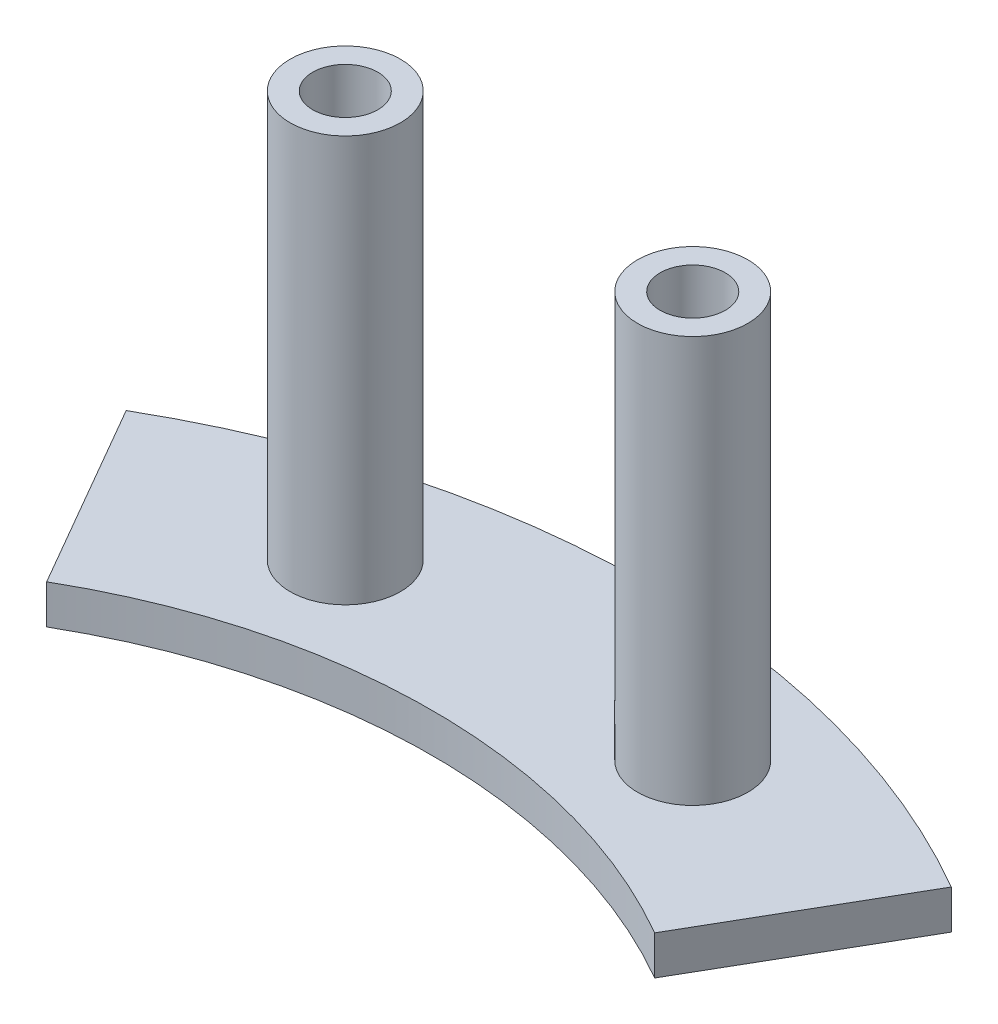
ISO-10303-21;
HEADER;
FILE_DESCRIPTION(('STEP AP214'),'2;1');
FILE_NAME('part.step','',(''),(''),'','','');
FILE_SCHEMA(('AUTOMOTIVE_DESIGN { 1 0 10303 214 1 1 1 1 }'));
ENDSEC;
DATA;
#1=APPLICATION_CONTEXT('core data for automotive mechanical design processes');
#2=APPLICATION_PROTOCOL_DEFINITION('international standard','automotive_design',2000,#1);
#3=PRODUCT_CONTEXT('',#1,'mechanical');
#4=PRODUCT('Part','Part','',(#3));
#5=PRODUCT_RELATED_PRODUCT_CATEGORY('part','',(#4));
#6=PRODUCT_DEFINITION_FORMATION('','',#4);
#7=PRODUCT_DEFINITION_CONTEXT('part definition',#1,'design');
#8=PRODUCT_DEFINITION('design','',#6,#7);
#9=PRODUCT_DEFINITION_SHAPE('','',#8);
#10=(LENGTH_UNIT() NAMED_UNIT(*) SI_UNIT(.MILLI.,.METRE.));
#11=(NAMED_UNIT(*) PLANE_ANGLE_UNIT() SI_UNIT($,.RADIAN.));
#12=(NAMED_UNIT(*) SI_UNIT($,.STERADIAN.) SOLID_ANGLE_UNIT());
#13=UNCERTAINTY_MEASURE_WITH_UNIT(LENGTH_MEASURE(1.E-05),#10,'distance_accuracy_value','');
#14=(GEOMETRIC_REPRESENTATION_CONTEXT(3) GLOBAL_UNCERTAINTY_ASSIGNED_CONTEXT((#13)) GLOBAL_UNIT_ASSIGNED_CONTEXT((#10,
#11,#12)) REPRESENTATION_CONTEXT('',''));
#15=CARTESIAN_POINT('',(0.,0.,0.));
#16=DIRECTION('',(0.,0.,1.));
#17=DIRECTION('',(1.,0.,0.));
#18=AXIS2_PLACEMENT_3D('',#15,#16,#17);
#19=CARTESIAN_POINT('',(0.,1.8,0.));
#20=DIRECTION('',(0.,-1.,0.));
#21=DIRECTION('',(0.,0.,-1.));
#22=AXIS2_PLACEMENT_3D('',#19,#20,#21);
#23=CYLINDRICAL_SURFACE('',#22,38.);
#24=CARTESIAN_POINT('',(0.,0.,0.));
#25=DIRECTION('',(0.,1.,0.));
#26=DIRECTION('',(0.,0.,-1.));
#27=AXIS2_PLACEMENT_3D('',#24,#25,#26);
#28=CIRCLE('',#27,38.);
#29=CARTESIAN_POINT('',(18.9999999999999,0.,-32.9089653438087));
#30=VERTEX_POINT('',#29);
#31=CARTESIAN_POINT('',(-19.0000000000001,0.,-32.9089653438086));
#32=VERTEX_POINT('',#31);
#33=EDGE_CURVE('E108',#30,#32,#28,.T.);
#34=ORIENTED_EDGE('',*,*,#33,.T.);
#35=DIRECTION('',(0.,-1.,0.));
#36=VECTOR('',#35,1.);
#37=CARTESIAN_POINT('',(-19.0000000000001,1.8,-32.9089653438086));
#38=LINE('',#37,#36);
#39=CARTESIAN_POINT('',(-19.0000000000001,1.8,-32.9089653438086));
#40=VERTEX_POINT('',#39);
#41=EDGE_CURVE('E100',#40,#32,#38,.T.);
#42=ORIENTED_EDGE('',*,*,#41,.F.);
#43=CARTESIAN_POINT('',(0.,1.8,0.));
#44=DIRECTION('',(0.,1.,0.));
#45=DIRECTION('',(0.,0.,-1.));
#46=AXIS2_PLACEMENT_3D('',#43,#44,#45);
#47=CIRCLE('',#46,38.);
#48=CARTESIAN_POINT('',(18.9999999999999,1.8,-32.9089653438087));
#49=VERTEX_POINT('',#48);
#50=EDGE_CURVE('E92',#49,#40,#47,.T.);
#51=ORIENTED_EDGE('',*,*,#50,.F.);
#52=DIRECTION('',(0.,-1.,0.));
#53=VECTOR('',#52,1.);
#54=CARTESIAN_POINT('',(18.9999999999999,1.8,-32.9089653438087));
#55=LINE('',#54,#53);
#56=EDGE_CURVE('E104',#49,#30,#55,.T.);
#57=ORIENTED_EDGE('',*,*,#56,.T.);
#58=EDGE_LOOP('',(#34,#42,#51,#57));
#59=FACE_BOUND('',#58,.T.);
#60=ADVANCED_FACE('F41',(#59),#23,.T.);
#61=CARTESIAN_POINT('',(-19.0000000000001,1.8,-32.9089653438086));
#62=DIRECTION('',(0.866025403784436,0.,-0.500000000000004));
#63=DIRECTION('',(-0.500000000000004,0.,-0.866025403784437));
#64=AXIS2_PLACEMENT_3D('',#61,#62,#63);
#65=PLANE('',#64);
#66=DIRECTION('',(0.500000000000004,0.,0.866025403784436));
#67=VECTOR('',#66,1.);
#68=CARTESIAN_POINT('',(-19.0000000000001,0.,-32.9089653438086));
#69=LINE('',#68,#67);
#70=CARTESIAN_POINT('',(-14.0000000000001,0.,-24.2487113059642));
#71=VERTEX_POINT('',#70);
#72=EDGE_CURVE('E96',#32,#71,#69,.T.);
#73=ORIENTED_EDGE('',*,*,#72,.T.);
#74=DIRECTION('',(0.,-1.,0.));
#75=VECTOR('',#74,1.);
#76=CARTESIAN_POINT('',(-14.0000000000001,1.8,-24.2487113059642));
#77=LINE('',#76,#75);
#78=CARTESIAN_POINT('',(-14.0000000000001,1.8,-24.2487113059642));
#79=VERTEX_POINT('',#78);
#80=EDGE_CURVE('E98',#79,#71,#77,.T.);
#81=ORIENTED_EDGE('',*,*,#80,.F.);
#82=DIRECTION('',(0.500000000000004,0.,0.866025403784436));
#83=VECTOR('',#82,1.);
#84=CARTESIAN_POINT('',(-19.0000000000001,1.8,-32.9089653438086));
#85=LINE('',#84,#83);
#86=EDGE_CURVE('E86',#40,#79,#85,.T.);
#87=ORIENTED_EDGE('',*,*,#86,.F.);
#88=ORIENTED_EDGE('',*,*,#41,.T.);
#89=EDGE_LOOP('',(#73,#81,#87,#88));
#90=FACE_BOUND('',#89,.T.);
#91=ADVANCED_FACE('F97',(#90),#65,.F.);
#92=CARTESIAN_POINT('',(0.,1.8,0.));
#93=DIRECTION('',(0.,-1.,0.));
#94=DIRECTION('',(0.,0.,-1.));
#95=AXIS2_PLACEMENT_3D('',#92,#93,#94);
#96=CYLINDRICAL_SURFACE('',#95,28.);
#97=CARTESIAN_POINT('',(0.,0.,0.));
#98=DIRECTION('',(0.,-1.,0.));
#99=DIRECTION('',(0.,0.,-1.));
#100=AXIS2_PLACEMENT_3D('',#97,#98,#99);
#101=CIRCLE('',#100,28.);
#102=CARTESIAN_POINT('',(13.9999999999999,0.,-24.2487113059643));
#103=VERTEX_POINT('',#102);
#104=EDGE_CURVE('E73',#71,#103,#101,.T.);
#105=ORIENTED_EDGE('',*,*,#104,.T.);
#106=DIRECTION('',(0.,-1.,0.));
#107=VECTOR('',#106,1.);
#108=CARTESIAN_POINT('',(13.9999999999999,1.8,-24.2487113059643));
#109=LINE('',#108,#107);
#110=CARTESIAN_POINT('',(13.9999999999999,1.8,-24.2487113059643));
#111=VERTEX_POINT('',#110);
#112=EDGE_CURVE('E99',#111,#103,#109,.T.);
#113=ORIENTED_EDGE('',*,*,#112,.F.);
#114=CARTESIAN_POINT('',(0.,1.8,0.));
#115=DIRECTION('',(0.,-1.,0.));
#116=DIRECTION('',(0.,0.,-1.));
#117=AXIS2_PLACEMENT_3D('',#114,#115,#116);
#118=CIRCLE('',#117,28.);
#119=EDGE_CURVE('E91',#79,#111,#118,.T.);
#120=ORIENTED_EDGE('',*,*,#119,.F.);
#121=ORIENTED_EDGE('',*,*,#80,.T.);
#122=EDGE_LOOP('',(#105,#113,#120,#121));
#123=FACE_BOUND('',#122,.T.);
#124=ADVANCED_FACE('F105',(#123),#96,.F.);
#125=CARTESIAN_POINT('',(18.9999999999999,1.8,-32.9089653438087));
#126=DIRECTION('',(-0.86602540378444,0.,-0.499999999999998));
#127=DIRECTION('',(-0.499999999999998,0.,0.86602540378444));
#128=AXIS2_PLACEMENT_3D('',#125,#126,#127);
#129=PLANE('',#128);
#130=DIRECTION('',(0.499999999999998,0.,-0.86602540378444));
#131=VECTOR('',#130,1.);
#132=CARTESIAN_POINT('',(18.9999999999999,0.,-32.9089653438087));
#133=LINE('',#132,#131);
#134=EDGE_CURVE('E78',#103,#30,#133,.T.);
#135=ORIENTED_EDGE('',*,*,#134,.T.);
#136=ORIENTED_EDGE('',*,*,#56,.F.);
#137=DIRECTION('',(0.499999999999998,0.,-0.86602540378444));
#138=VECTOR('',#137,1.);
#139=CARTESIAN_POINT('',(18.9999999999999,1.8,-32.9089653438087));
#140=LINE('',#139,#138);
#141=EDGE_CURVE('E60',#111,#49,#140,.T.);
#142=ORIENTED_EDGE('',*,*,#141,.F.);
#143=ORIENTED_EDGE('',*,*,#112,.T.);
#144=EDGE_LOOP('',(#135,#136,#142,#143));
#145=FACE_BOUND('',#144,.T.);
#146=ADVANCED_FACE('F121',(#145),#129,.F.);
#147=CARTESIAN_POINT('',(0.,1.8,0.));
#148=DIRECTION('',(0.,-1.,0.));
#149=DIRECTION('',(0.,0.,-1.));
#150=AXIS2_PLACEMENT_3D('',#147,#148,#149);
#151=PLANE('',#150);
#152=CARTESIAN_POINT('',(8.,1.8,-32.));
#153=DIRECTION('',(0.,-1.,0.));
#154=DIRECTION('',(0.,0.,-1.));
#155=AXIS2_PLACEMENT_3D('',#152,#153,#154);
#156=CIRCLE('',#155,2.54);
#157=CARTESIAN_POINT('',(8.,1.8,-34.54));
#158=VERTEX_POINT('',#157);
#159=EDGE_CURVE('E11',#158,#158,#156,.F.);
#160=ORIENTED_EDGE('',*,*,#159,.F.);
#161=EDGE_LOOP('',(#160));
#162=FACE_BOUND('',#161,.T.);
#163=CARTESIAN_POINT('',(-8.,1.8,-32.));
#164=DIRECTION('',(0.,-1.,0.));
#165=DIRECTION('',(0.,0.,-1.));
#166=AXIS2_PLACEMENT_3D('',#163,#164,#165);
#167=CIRCLE('',#166,2.54);
#168=CARTESIAN_POINT('',(-8.,1.8,-34.54));
#169=VERTEX_POINT('',#168);
#170=EDGE_CURVE('E47',#169,#169,#167,.F.);
#171=ORIENTED_EDGE('',*,*,#170,.F.);
#172=EDGE_LOOP('',(#171));
#173=FACE_BOUND('',#172,.T.);
#174=ORIENTED_EDGE('',*,*,#50,.T.);
#175=ORIENTED_EDGE('',*,*,#86,.T.);
#176=ORIENTED_EDGE('',*,*,#119,.T.);
#177=ORIENTED_EDGE('',*,*,#141,.T.);
#178=EDGE_LOOP('',(#174,#175,#176,#177));
#179=FACE_BOUND('',#178,.T.);
#180=ADVANCED_FACE('F89',(#162,#173,#179),#151,.F.);
#181=CARTESIAN_POINT('',(0.,0.,0.));
#182=DIRECTION('',(0.,-1.,0.));
#183=DIRECTION('',(0.,0.,-1.));
#184=AXIS2_PLACEMENT_3D('',#181,#182,#183);
#185=PLANE('',#184);
#186=ORIENTED_EDGE('',*,*,#33,.F.);
#187=ORIENTED_EDGE('',*,*,#134,.F.);
#188=ORIENTED_EDGE('',*,*,#104,.F.);
#189=ORIENTED_EDGE('',*,*,#72,.F.);
#190=EDGE_LOOP('',(#186,#187,#188,#189));
#191=FACE_BOUND('',#190,.T.);
#192=ADVANCED_FACE('F124',(#191),#185,.T.);
#193=CARTESIAN_POINT('',(-8.,20.5,-32.));
#194=DIRECTION('',(0.,-1.,0.));
#195=DIRECTION('',(0.,0.,-1.));
#196=AXIS2_PLACEMENT_3D('',#193,#194,#195);
#197=CYLINDRICAL_SURFACE('',#196,2.54);
#198=CARTESIAN_POINT('',(-8.,20.5,-32.));
#199=DIRECTION('',(0.,1.,0.));
#200=DIRECTION('',(0.,0.,1.));
#201=AXIS2_PLACEMENT_3D('',#198,#199,#200);
#202=CIRCLE('',#201,2.54);
#203=CARTESIAN_POINT('',(-8.,20.5,-29.46));
#204=VERTEX_POINT('',#203);
#205=EDGE_CURVE('E111',#204,#204,#202,.T.);
#206=ORIENTED_EDGE('',*,*,#205,.F.);
#207=EDGE_LOOP('',(#206));
#208=FACE_BOUND('',#207,.T.);
#209=ORIENTED_EDGE('',*,*,#170,.T.);
#210=EDGE_LOOP('',(#209));
#211=FACE_BOUND('',#210,.T.);
#212=ADVANCED_FACE('F119',(#208,#211),#197,.T.);
#213=CARTESIAN_POINT('',(-8.,20.5,-32.));
#214=DIRECTION('',(0.,1.,0.));
#215=DIRECTION('',(0.,0.,1.));
#216=AXIS2_PLACEMENT_3D('',#213,#214,#215);
#217=PLANE('',#216);
#218=CARTESIAN_POINT('',(-8.,20.5,-32.));
#219=DIRECTION('',(0.,1.,0.));
#220=DIRECTION('',(0.,0.,1.));
#221=AXIS2_PLACEMENT_3D('',#218,#219,#220);
#222=CIRCLE('',#221,1.5);
#223=CARTESIAN_POINT('',(-8.,20.5,-30.5));
#224=VERTEX_POINT('',#223);
#225=EDGE_CURVE('E156',#224,#224,#222,.T.);
#226=ORIENTED_EDGE('',*,*,#225,.F.);
#227=EDGE_LOOP('',(#226));
#228=FACE_BOUND('',#227,.T.);
#229=ORIENTED_EDGE('',*,*,#205,.T.);
#230=EDGE_LOOP('',(#229));
#231=FACE_BOUND('',#230,.T.);
#232=ADVANCED_FACE('F171',(#228,#231),#217,.T.);
#233=CARTESIAN_POINT('',(8.,20.5,-32.));
#234=DIRECTION('',(0.,-1.,0.));
#235=DIRECTION('',(0.,0.,-1.));
#236=AXIS2_PLACEMENT_3D('',#233,#234,#235);
#237=CYLINDRICAL_SURFACE('',#236,2.54);
#238=CARTESIAN_POINT('',(8.,20.5,-32.));
#239=DIRECTION('',(0.,1.,0.));
#240=DIRECTION('',(0.,0.,1.));
#241=AXIS2_PLACEMENT_3D('',#238,#239,#240);
#242=CIRCLE('',#241,2.54);
#243=CARTESIAN_POINT('',(8.,20.5,-29.46));
#244=VERTEX_POINT('',#243);
#245=EDGE_CURVE('E148',#244,#244,#242,.T.);
#246=ORIENTED_EDGE('',*,*,#245,.F.);
#247=EDGE_LOOP('',(#246));
#248=FACE_BOUND('',#247,.T.);
#249=ORIENTED_EDGE('',*,*,#159,.T.);
#250=EDGE_LOOP('',(#249));
#251=FACE_BOUND('',#250,.T.);
#252=ADVANCED_FACE('F172',(#248,#251),#237,.T.);
#253=CARTESIAN_POINT('',(8.,20.5,-32.));
#254=DIRECTION('',(0.,1.,0.));
#255=DIRECTION('',(0.,0.,1.));
#256=AXIS2_PLACEMENT_3D('',#253,#254,#255);
#257=PLANE('',#256);
#258=CARTESIAN_POINT('',(8.,20.5,-32.));
#259=DIRECTION('',(0.,1.,0.));
#260=DIRECTION('',(0.,0.,1.));
#261=AXIS2_PLACEMENT_3D('',#258,#259,#260);
#262=CIRCLE('',#261,1.5);
#263=CARTESIAN_POINT('',(8.,20.5,-30.5));
#264=VERTEX_POINT('',#263);
#265=EDGE_CURVE('E146',#264,#264,#262,.T.);
#266=ORIENTED_EDGE('',*,*,#265,.F.);
#267=EDGE_LOOP('',(#266));
#268=FACE_BOUND('',#267,.T.);
#269=ORIENTED_EDGE('',*,*,#245,.T.);
#270=EDGE_LOOP('',(#269));
#271=FACE_BOUND('',#270,.T.);
#272=ADVANCED_FACE('F182',(#268,#271),#257,.T.);
#273=CARTESIAN_POINT('',(8.,17.5,-32.));
#274=DIRECTION('',(0.,1.,0.));
#275=DIRECTION('',(0.,0.,1.));
#276=AXIS2_PLACEMENT_3D('',#273,#274,#275);
#277=CYLINDRICAL_SURFACE('',#276,1.5);
#278=CARTESIAN_POINT('',(8.,17.5,-32.));
#279=DIRECTION('',(0.,1.,0.));
#280=DIRECTION('',(0.,0.,1.));
#281=AXIS2_PLACEMENT_3D('',#278,#279,#280);
#282=CIRCLE('',#281,1.5);
#283=CARTESIAN_POINT('',(8.,17.5,-30.5));
#284=VERTEX_POINT('',#283);
#285=EDGE_CURVE('E151',#284,#284,#282,.T.);
#286=ORIENTED_EDGE('',*,*,#285,.F.);
#287=EDGE_LOOP('',(#286));
#288=FACE_BOUND('',#287,.T.);
#289=ORIENTED_EDGE('',*,*,#265,.T.);
#290=EDGE_LOOP('',(#289));
#291=FACE_BOUND('',#290,.T.);
#292=ADVANCED_FACE('F190',(#288,#291),#277,.F.);
#293=CARTESIAN_POINT('',(8.,17.5,-32.));
#294=DIRECTION('',(0.,1.,0.));
#295=DIRECTION('',(0.,0.,1.));
#296=AXIS2_PLACEMENT_3D('',#293,#294,#295);
#297=PLANE('',#296);
#298=ORIENTED_EDGE('',*,*,#285,.T.);
#299=EDGE_LOOP('',(#298));
#300=FACE_BOUND('',#299,.T.);
#301=ADVANCED_FACE('F170',(#300),#297,.T.);
#302=CARTESIAN_POINT('',(-8.,17.5,-32.));
#303=DIRECTION('',(0.,1.,0.));
#304=DIRECTION('',(0.,0.,1.));
#305=AXIS2_PLACEMENT_3D('',#302,#303,#304);
#306=CYLINDRICAL_SURFACE('',#305,1.5);
#307=CARTESIAN_POINT('',(-8.,17.5,-32.));
#308=DIRECTION('',(0.,1.,0.));
#309=DIRECTION('',(0.,0.,1.));
#310=AXIS2_PLACEMENT_3D('',#307,#308,#309);
#311=CIRCLE('',#310,1.5);
#312=CARTESIAN_POINT('',(-8.,17.5,-30.5));
#313=VERTEX_POINT('',#312);
#314=EDGE_CURVE('E150',#313,#313,#311,.T.);
#315=ORIENTED_EDGE('',*,*,#314,.F.);
#316=EDGE_LOOP('',(#315));
#317=FACE_BOUND('',#316,.T.);
#318=ORIENTED_EDGE('',*,*,#225,.T.);
#319=EDGE_LOOP('',(#318));
#320=FACE_BOUND('',#319,.T.);
#321=ADVANCED_FACE('F165',(#317,#320),#306,.F.);
#322=CARTESIAN_POINT('',(-8.,17.5,-32.));
#323=DIRECTION('',(0.,1.,0.));
#324=DIRECTION('',(0.,0.,1.));
#325=AXIS2_PLACEMENT_3D('',#322,#323,#324);
#326=PLANE('',#325);
#327=ORIENTED_EDGE('',*,*,#314,.T.);
#328=EDGE_LOOP('',(#327));
#329=FACE_BOUND('',#328,.T.);
#330=ADVANCED_FACE('F162',(#329),#326,.T.);
#331=CLOSED_SHELL('',(#60,#91,#124,#146,#180,#192,#212,#232,#252,#272,#292,#301,#321,#330));
#332=MANIFOLD_SOLID_BREP('B2',#331);
#333=ADVANCED_BREP_SHAPE_REPRESENTATION('',(#18,#332),#14);
#334=SHAPE_DEFINITION_REPRESENTATION(#9,#333);
ENDSEC;
END-ISO-10303-21;
